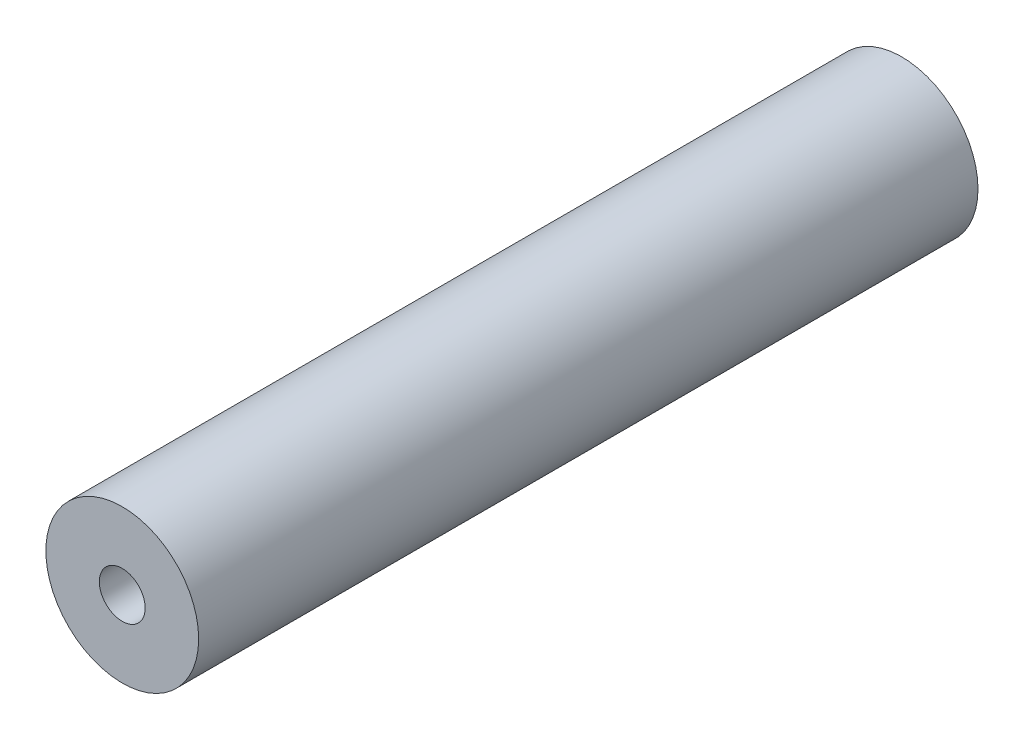
ISO-10303-21;
HEADER;
FILE_DESCRIPTION(('STEP AP214'),'2;1');
FILE_NAME('part.step','',(''),(''),'','','');
FILE_SCHEMA(('AUTOMOTIVE_DESIGN { 1 0 10303 214 1 1 1 1 }'));
ENDSEC;
DATA;
#1=APPLICATION_CONTEXT('core data for automotive mechanical design processes');
#2=APPLICATION_PROTOCOL_DEFINITION('international standard','automotive_design',2000,#1);
#3=PRODUCT_CONTEXT('',#1,'mechanical');
#4=PRODUCT('Part','Part','',(#3));
#5=PRODUCT_RELATED_PRODUCT_CATEGORY('part','',(#4));
#6=PRODUCT_DEFINITION_FORMATION('','',#4);
#7=PRODUCT_DEFINITION_CONTEXT('part definition',#1,'design');
#8=PRODUCT_DEFINITION('design','',#6,#7);
#9=PRODUCT_DEFINITION_SHAPE('','',#8);
#10=(LENGTH_UNIT() NAMED_UNIT(*) SI_UNIT(.MILLI.,.METRE.));
#11=(NAMED_UNIT(*) PLANE_ANGLE_UNIT() SI_UNIT($,.RADIAN.));
#12=(NAMED_UNIT(*) SI_UNIT($,.STERADIAN.) SOLID_ANGLE_UNIT());
#13=UNCERTAINTY_MEASURE_WITH_UNIT(LENGTH_MEASURE(1.E-05),#10,'distance_accuracy_value','');
#14=(GEOMETRIC_REPRESENTATION_CONTEXT(3) GLOBAL_UNCERTAINTY_ASSIGNED_CONTEXT((#13)) GLOBAL_UNIT_ASSIGNED_CONTEXT((#10,
#11,#12)) REPRESENTATION_CONTEXT('',''));
#15=CARTESIAN_POINT('',(0.,0.,0.));
#16=DIRECTION('',(0.,0.,1.));
#17=DIRECTION('',(1.,0.,0.));
#18=AXIS2_PLACEMENT_3D('',#15,#16,#17);
#19=CARTESIAN_POINT('',(0.,0.,51.));
#20=DIRECTION('',(0.,0.,1.));
#21=DIRECTION('',(1.,0.,0.));
#22=AXIS2_PLACEMENT_3D('',#19,#20,#21);
#23=PLANE('',#22);
#24=CARTESIAN_POINT('',(0.,0.,51.));
#25=DIRECTION('',(0.,0.,1.));
#26=DIRECTION('',(1.,0.,0.));
#27=AXIS2_PLACEMENT_3D('',#24,#25,#26);
#28=CIRCLE('',#27,5.);
#29=CARTESIAN_POINT('',(5.,0.,51.));
#30=VERTEX_POINT('',#29);
#31=EDGE_CURVE('E10',#30,#30,#28,.T.);
#32=ORIENTED_EDGE('',*,*,#31,.T.);
#33=EDGE_LOOP('',(#32));
#34=FACE_BOUND('',#33,.T.);
#35=CARTESIAN_POINT('',(0.,0.,51.));
#36=DIRECTION('',(0.,0.,1.));
#37=DIRECTION('',(1.,0.,0.));
#38=AXIS2_PLACEMENT_3D('',#35,#36,#37);
#39=CIRCLE('',#38,1.5);
#40=CARTESIAN_POINT('',(1.5,0.,51.));
#41=VERTEX_POINT('',#40);
#42=EDGE_CURVE('E42',#41,#41,#39,.T.);
#43=ORIENTED_EDGE('',*,*,#42,.F.);
#44=EDGE_LOOP('',(#43));
#45=FACE_BOUND('',#44,.T.);
#46=ADVANCED_FACE('F31',(#34,#45),#23,.T.);
#47=CARTESIAN_POINT('',(0.,0.,0.));
#48=DIRECTION('',(0.,0.,1.));
#49=DIRECTION('',(1.,0.,0.));
#50=AXIS2_PLACEMENT_3D('',#47,#48,#49);
#51=PLANE('',#50);
#52=CARTESIAN_POINT('',(0.,0.,0.));
#53=DIRECTION('',(0.,0.,1.));
#54=DIRECTION('',(1.,0.,0.));
#55=AXIS2_PLACEMENT_3D('',#52,#53,#54);
#56=CIRCLE('',#55,5.);
#57=CARTESIAN_POINT('',(5.,0.,0.));
#58=VERTEX_POINT('',#57);
#59=EDGE_CURVE('E35',#58,#58,#56,.T.);
#60=ORIENTED_EDGE('',*,*,#59,.F.);
#61=EDGE_LOOP('',(#60));
#62=FACE_BOUND('',#61,.T.);
#63=CARTESIAN_POINT('',(0.,0.,0.));
#64=DIRECTION('',(0.,0.,1.));
#65=DIRECTION('',(1.,0.,0.));
#66=AXIS2_PLACEMENT_3D('',#63,#64,#65);
#67=CIRCLE('',#66,1.5);
#68=CARTESIAN_POINT('',(1.5,0.,0.));
#69=VERTEX_POINT('',#68);
#70=EDGE_CURVE('E44',#69,#69,#67,.T.);
#71=ORIENTED_EDGE('',*,*,#70,.T.);
#72=EDGE_LOOP('',(#71));
#73=FACE_BOUND('',#72,.T.);
#74=ADVANCED_FACE('F54',(#62,#73),#51,.F.);
#75=CARTESIAN_POINT('',(0.,0.,51.));
#76=DIRECTION('',(0.,0.,-1.));
#77=DIRECTION('',(-1.,0.,0.));
#78=AXIS2_PLACEMENT_3D('',#75,#76,#77);
#79=CYLINDRICAL_SURFACE('',#78,5.);
#80=ORIENTED_EDGE('',*,*,#31,.F.);
#81=EDGE_LOOP('',(#80));
#82=FACE_BOUND('',#81,.T.);
#83=ORIENTED_EDGE('',*,*,#59,.T.);
#84=EDGE_LOOP('',(#83));
#85=FACE_BOUND('',#84,.T.);
#86=ADVANCED_FACE('F33',(#82,#85),#79,.T.);
#87=CARTESIAN_POINT('',(0.,0.,51.));
#88=DIRECTION('',(0.,0.,-1.));
#89=DIRECTION('',(-1.,0.,0.));
#90=AXIS2_PLACEMENT_3D('',#87,#88,#89);
#91=CYLINDRICAL_SURFACE('',#90,1.5);
#92=ORIENTED_EDGE('',*,*,#42,.T.);
#93=EDGE_LOOP('',(#92));
#94=FACE_BOUND('',#93,.T.);
#95=ORIENTED_EDGE('',*,*,#70,.F.);
#96=EDGE_LOOP('',(#95));
#97=FACE_BOUND('',#96,.T.);
#98=ADVANCED_FACE('F50',(#94,#97),#91,.F.);
#99=CLOSED_SHELL('',(#46,#74,#86,#98));
#100=MANIFOLD_SOLID_BREP('B2',#99);
#101=ADVANCED_BREP_SHAPE_REPRESENTATION('',(#18,#100),#14);
#102=SHAPE_DEFINITION_REPRESENTATION(#9,#101);
ENDSEC;
END-ISO-10303-21;
